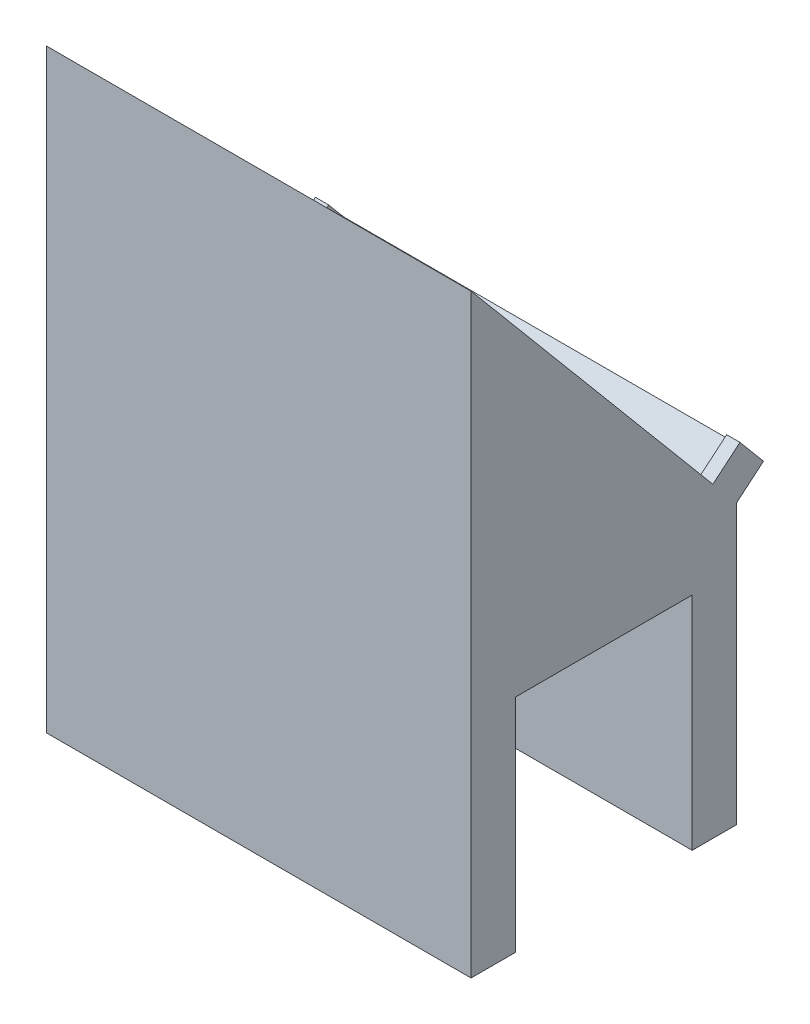
ISO-10303-21;
HEADER;
FILE_DESCRIPTION(('STEP AP214'),'2;1');
FILE_NAME('part.step','',(''),(''),'','','');
FILE_SCHEMA(('AUTOMOTIVE_DESIGN { 1 0 10303 214 1 1 1 1 }'));
ENDSEC;
DATA;
#1=APPLICATION_CONTEXT('core data for automotive mechanical design processes');
#2=APPLICATION_PROTOCOL_DEFINITION('international standard','automotive_design',2000,#1);
#3=PRODUCT_CONTEXT('',#1,'mechanical');
#4=PRODUCT('Part','Part','',(#3));
#5=PRODUCT_RELATED_PRODUCT_CATEGORY('part','',(#4));
#6=PRODUCT_DEFINITION_FORMATION('','',#4);
#7=PRODUCT_DEFINITION_CONTEXT('part definition',#1,'design');
#8=PRODUCT_DEFINITION('design','',#6,#7);
#9=PRODUCT_DEFINITION_SHAPE('','',#8);
#10=(LENGTH_UNIT() NAMED_UNIT(*) SI_UNIT(.MILLI.,.METRE.));
#11=(NAMED_UNIT(*) PLANE_ANGLE_UNIT() SI_UNIT($,.RADIAN.));
#12=(NAMED_UNIT(*) SI_UNIT($,.STERADIAN.) SOLID_ANGLE_UNIT());
#13=UNCERTAINTY_MEASURE_WITH_UNIT(LENGTH_MEASURE(1.E-05),#10,'distance_accuracy_value','');
#14=(GEOMETRIC_REPRESENTATION_CONTEXT(3) GLOBAL_UNCERTAINTY_ASSIGNED_CONTEXT((#13)) GLOBAL_UNIT_ASSIGNED_CONTEXT((#10,
#11,#12)) REPRESENTATION_CONTEXT('',''));
#15=CARTESIAN_POINT('',(0.,0.,0.));
#16=DIRECTION('',(0.,0.,1.));
#17=DIRECTION('',(1.,0.,0.));
#18=AXIS2_PLACEMENT_3D('',#15,#16,#17);
#19=CARTESIAN_POINT('',(96.,109.262066558535,0.));
#20=DIRECTION('',(0.,0.64278760968654,-0.766044443118977));
#21=DIRECTION('',(0.,0.766044443118977,0.64278760968654));
#22=AXIS2_PLACEMENT_3D('',#19,#20,#21);
#23=PLANE('',#22);
#24=DIRECTION('',(0.,-0.766044443118977,-0.64278760968654));
#25=VECTOR('',#24,1.);
#26=CARTESIAN_POINT('',(96.,109.262066558535,0.));
#27=LINE('',#26,#25);
#28=CARTESIAN_POINT('',(96.,109.262066558535,0.));
#29=VERTEX_POINT('',#28);
#30=CARTESIAN_POINT('',(96.,44.106186697576,-54.6722747603623));
#31=VERTEX_POINT('',#30);
#32=EDGE_CURVE('E247',#29,#31,#27,.T.);
#33=ORIENTED_EDGE('',*,*,#32,.T.);
#34=DIRECTION('',(-1.,0.,0.));
#35=VECTOR('',#34,1.);
#36=CARTESIAN_POINT('',(0.,44.106186697576,-54.6722747603623));
#37=LINE('',#36,#35);
#38=CARTESIAN_POINT('',(93.,44.106186697576,-54.6722747603623));
#39=VERTEX_POINT('',#38);
#40=EDGE_CURVE('E89',#31,#39,#37,.T.);
#41=ORIENTED_EDGE('',*,*,#40,.T.);
#42=DIRECTION('',(0.,-0.766044443118977,-0.64278760968654));
#43=VECTOR('',#42,1.);
#44=CARTESIAN_POINT('',(93.,45.1444539062616,-53.8010651284908));
#45=LINE('',#44,#43);
#46=CARTESIAN_POINT('',(93.,40.0549843322399,-58.0716371709404));
#47=VERTEX_POINT('',#46);
#48=EDGE_CURVE('E94',#39,#47,#45,.T.);
#49=ORIENTED_EDGE('',*,*,#48,.T.);
#50=DIRECTION('',(-1.,0.,0.));
#51=VECTOR('',#50,1.);
#52=CARTESIAN_POINT('',(0.,40.0549843322399,-58.0716371709404));
#53=LINE('',#52,#51);
#54=CARTESIAN_POINT('',(3.,40.0549843322399,-58.0716371709404));
#55=VERTEX_POINT('',#54);
#56=EDGE_CURVE('E239',#47,#55,#53,.T.);
#57=ORIENTED_EDGE('',*,*,#56,.T.);
#58=DIRECTION('',(0.,-0.766044443118977,-0.642787609686541));
#59=VECTOR('',#58,1.);
#60=CARTESIAN_POINT('',(3.,44.106186697576,-54.6722747603623));
#61=LINE('',#60,#59);
#62=CARTESIAN_POINT('',(3.,44.106186697576,-54.6722747603623));
#63=VERTEX_POINT('',#62);
#64=EDGE_CURVE('E230',#63,#55,#61,.T.);
#65=ORIENTED_EDGE('',*,*,#64,.F.);
#66=DIRECTION('',(1.,0.,0.));
#67=VECTOR('',#66,1.);
#68=CARTESIAN_POINT('',(0.,44.106186697576,-54.6722747603623));
#69=LINE('',#68,#67);
#70=CARTESIAN_POINT('',(0.,44.106186697576,-54.6722747603623));
#71=VERTEX_POINT('',#70);
#72=EDGE_CURVE('E226',#71,#63,#69,.T.);
#73=ORIENTED_EDGE('',*,*,#72,.F.);
#74=DIRECTION('',(0.,-0.766044443118977,-0.64278760968654));
#75=VECTOR('',#74,1.);
#76=CARTESIAN_POINT('',(0.,109.262066558535,0.));
#77=LINE('',#76,#75);
#78=CARTESIAN_POINT('',(0.,109.262066558535,0.));
#79=VERTEX_POINT('',#78);
#80=EDGE_CURVE('E274',#79,#71,#77,.T.);
#81=ORIENTED_EDGE('',*,*,#80,.F.);
#82=DIRECTION('',(-1.,0.,0.));
#83=VECTOR('',#82,1.);
#84=CARTESIAN_POINT('',(96.,109.262066558535,0.));
#85=LINE('',#84,#83);
#86=EDGE_CURVE('E75',#29,#79,#85,.T.);
#87=ORIENTED_EDGE('',*,*,#86,.F.);
#88=EDGE_LOOP('',(#33,#41,#49,#57,#65,#73,#81,#87));
#89=FACE_BOUND('',#88,.T.);
#90=ADVANCED_FACE('F71',(#89),#23,.T.);
#91=CARTESIAN_POINT('',(96.,-25.2428594307041,0.));
#92=DIRECTION('',(0.,0.,1.));
#93=DIRECTION('',(1.,0.,0.));
#94=AXIS2_PLACEMENT_3D('',#91,#92,#93);
#95=PLANE('',#94);
#96=DIRECTION('',(0.,1.,0.));
#97=VECTOR('',#96,1.);
#98=CARTESIAN_POINT('',(0.,-25.2428594307041,0.));
#99=LINE('',#98,#97);
#100=CARTESIAN_POINT('',(0.,-25.2428594307041,0.));
#101=VERTEX_POINT('',#100);
#102=EDGE_CURVE('E215',#101,#79,#99,.T.);
#103=ORIENTED_EDGE('',*,*,#102,.F.);
#104=DIRECTION('',(-1.,0.,0.));
#105=VECTOR('',#104,1.);
#106=CARTESIAN_POINT('',(96.,-25.2428594307041,0.));
#107=LINE('',#106,#105);
#108=CARTESIAN_POINT('',(96.,-25.2428594307041,0.));
#109=VERTEX_POINT('',#108);
#110=EDGE_CURVE('E12',#109,#101,#107,.T.);
#111=ORIENTED_EDGE('',*,*,#110,.F.);
#112=DIRECTION('',(0.,1.,0.));
#113=VECTOR('',#112,1.);
#114=CARTESIAN_POINT('',(96.,-25.2428594307041,0.));
#115=LINE('',#114,#113);
#116=EDGE_CURVE('E243',#109,#29,#115,.T.);
#117=ORIENTED_EDGE('',*,*,#116,.T.);
#118=ORIENTED_EDGE('',*,*,#86,.T.);
#119=EDGE_LOOP('',(#103,#111,#117,#118));
#120=FACE_BOUND('',#119,.T.);
#121=ADVANCED_FACE('F73',(#120),#95,.T.);
#122=CARTESIAN_POINT('',(96.,-25.2428594307041,-10.));
#123=DIRECTION('',(0.,-1.,0.));
#124=DIRECTION('',(0.,0.,-1.));
#125=AXIS2_PLACEMENT_3D('',#122,#123,#124);
#126=PLANE('',#125);
#127=DIRECTION('',(0.,0.,1.));
#128=VECTOR('',#127,1.);
#129=CARTESIAN_POINT('',(0.,-25.2428594307041,-10.));
#130=LINE('',#129,#128);
#131=CARTESIAN_POINT('',(0.,-25.2428594307041,-10.));
#132=VERTEX_POINT('',#131);
#133=EDGE_CURVE('E248',#132,#101,#130,.T.);
#134=ORIENTED_EDGE('',*,*,#133,.F.);
#135=DIRECTION('',(-1.,0.,0.));
#136=VECTOR('',#135,1.);
#137=CARTESIAN_POINT('',(96.,-25.2428594307041,-10.));
#138=LINE('',#137,#136);
#139=CARTESIAN_POINT('',(96.,-25.2428594307041,-10.));
#140=VERTEX_POINT('',#139);
#141=EDGE_CURVE('E81',#140,#132,#138,.T.);
#142=ORIENTED_EDGE('',*,*,#141,.F.);
#143=DIRECTION('',(0.,0.,1.));
#144=VECTOR('',#143,1.);
#145=CARTESIAN_POINT('',(96.,-25.2428594307041,-10.));
#146=LINE('',#145,#144);
#147=EDGE_CURVE('E268',#140,#109,#146,.T.);
#148=ORIENTED_EDGE('',*,*,#147,.T.);
#149=ORIENTED_EDGE('',*,*,#110,.T.);
#150=EDGE_LOOP('',(#134,#142,#148,#149));
#151=FACE_BOUND('',#150,.T.);
#152=ADVANCED_FACE('F323',(#151),#126,.T.);
#153=CARTESIAN_POINT('',(96.,-25.2428594307041,-10.));
#154=DIRECTION('',(0.,0.,1.));
#155=DIRECTION('',(1.,0.,0.));
#156=AXIS2_PLACEMENT_3D('',#153,#154,#155);
#157=PLANE('',#156);
#158=DIRECTION('',(0.,1.,0.));
#159=VECTOR('',#158,1.);
#160=CARTESIAN_POINT('',(0.,-25.2428594307041,-10.));
#161=LINE('',#160,#159);
#162=CARTESIAN_POINT('',(0.,24.7571405692959,-10.));
#163=VERTEX_POINT('',#162);
#164=EDGE_CURVE('E291',#132,#163,#161,.T.);
#165=ORIENTED_EDGE('',*,*,#164,.T.);
#166=DIRECTION('',(-1.,0.,0.));
#167=VECTOR('',#166,1.);
#168=CARTESIAN_POINT('',(96.,24.7571405692959,-10.));
#169=LINE('',#168,#167);
#170=CARTESIAN_POINT('',(96.,24.7571405692959,-10.));
#171=VERTEX_POINT('',#170);
#172=EDGE_CURVE('E299',#171,#163,#169,.T.);
#173=ORIENTED_EDGE('',*,*,#172,.F.);
#174=DIRECTION('',(0.,1.,0.));
#175=VECTOR('',#174,1.);
#176=CARTESIAN_POINT('',(96.,-25.2428594307041,-10.));
#177=LINE('',#176,#175);
#178=EDGE_CURVE('E265',#140,#171,#177,.T.);
#179=ORIENTED_EDGE('',*,*,#178,.F.);
#180=ORIENTED_EDGE('',*,*,#141,.T.);
#181=EDGE_LOOP('',(#165,#173,#179,#180));
#182=FACE_BOUND('',#181,.T.);
#183=ADVANCED_FACE('F398',(#182),#157,.F.);
#184=CARTESIAN_POINT('',(96.,24.7571405692959,-10.));
#185=DIRECTION('',(0.,1.,0.));
#186=DIRECTION('',(0.,0.,1.));
#187=AXIS2_PLACEMENT_3D('',#184,#185,#186);
#188=PLANE('',#187);
#189=DIRECTION('',(0.,0.,-1.));
#190=VECTOR('',#189,1.);
#191=CARTESIAN_POINT('',(0.,24.7571405692959,-10.));
#192=LINE('',#191,#190);
#193=CARTESIAN_POINT('',(0.,24.7571405692959,-50.));
#194=VERTEX_POINT('',#193);
#195=EDGE_CURVE('E288',#163,#194,#192,.T.);
#196=ORIENTED_EDGE('',*,*,#195,.T.);
#197=DIRECTION('',(-1.,0.,0.));
#198=VECTOR('',#197,1.);
#199=CARTESIAN_POINT('',(96.,24.7571405692959,-50.));
#200=LINE('',#199,#198);
#201=CARTESIAN_POINT('',(96.,24.7571405692959,-50.));
#202=VERTEX_POINT('',#201);
#203=EDGE_CURVE('E303',#202,#194,#200,.T.);
#204=ORIENTED_EDGE('',*,*,#203,.F.);
#205=DIRECTION('',(0.,0.,-1.));
#206=VECTOR('',#205,1.);
#207=CARTESIAN_POINT('',(96.,24.7571405692959,-10.));
#208=LINE('',#207,#206);
#209=EDGE_CURVE('E262',#171,#202,#208,.T.);
#210=ORIENTED_EDGE('',*,*,#209,.F.);
#211=ORIENTED_EDGE('',*,*,#172,.T.);
#212=EDGE_LOOP('',(#196,#204,#210,#211));
#213=FACE_BOUND('',#212,.T.);
#214=ADVANCED_FACE('F394',(#213),#188,.F.);
#215=CARTESIAN_POINT('',(96.,24.7571405692959,-50.));
#216=DIRECTION('',(0.,0.,-1.));
#217=DIRECTION('',(0.,1.,0.));
#218=AXIS2_PLACEMENT_3D('',#215,#216,#217);
#219=PLANE('',#218);
#220=DIRECTION('',(0.,-1.,0.));
#221=VECTOR('',#220,1.);
#222=CARTESIAN_POINT('',(0.,24.7571405692959,-50.));
#223=LINE('',#222,#221);
#224=CARTESIAN_POINT('',(0.,-25.2428594307041,-50.));
#225=VERTEX_POINT('',#224);
#226=EDGE_CURVE('E284',#194,#225,#223,.T.);
#227=ORIENTED_EDGE('',*,*,#226,.T.);
#228=DIRECTION('',(-1.,0.,0.));
#229=VECTOR('',#228,1.);
#230=CARTESIAN_POINT('',(96.,-25.2428594307041,-50.));
#231=LINE('',#230,#229);
#232=CARTESIAN_POINT('',(96.,-25.2428594307041,-50.));
#233=VERTEX_POINT('',#232);
#234=EDGE_CURVE('E307',#233,#225,#231,.T.);
#235=ORIENTED_EDGE('',*,*,#234,.F.);
#236=DIRECTION('',(0.,-1.,0.));
#237=VECTOR('',#236,1.);
#238=CARTESIAN_POINT('',(96.,24.7571405692959,-50.));
#239=LINE('',#238,#237);
#240=EDGE_CURVE('E259',#202,#233,#239,.T.);
#241=ORIENTED_EDGE('',*,*,#240,.F.);
#242=ORIENTED_EDGE('',*,*,#203,.T.);
#243=EDGE_LOOP('',(#227,#235,#241,#242));
#244=FACE_BOUND('',#243,.T.);
#245=ADVANCED_FACE('F390',(#244),#219,.F.);
#246=CARTESIAN_POINT('',(96.,-25.2428594307041,-60.));
#247=DIRECTION('',(0.,-1.,0.));
#248=DIRECTION('',(0.,0.,-1.));
#249=AXIS2_PLACEMENT_3D('',#246,#247,#248);
#250=PLANE('',#249);
#251=DIRECTION('',(0.,0.,1.));
#252=VECTOR('',#251,1.);
#253=CARTESIAN_POINT('',(0.,-25.2428594307041,-60.));
#254=LINE('',#253,#252);
#255=CARTESIAN_POINT('',(0.,-25.2428594307041,-60.));
#256=VERTEX_POINT('',#255);
#257=EDGE_CURVE('E280',#256,#225,#254,.T.);
#258=ORIENTED_EDGE('',*,*,#257,.F.);
#259=DIRECTION('',(-1.,0.,0.));
#260=VECTOR('',#259,1.);
#261=CARTESIAN_POINT('',(96.,-25.2428594307041,-60.));
#262=LINE('',#261,#260);
#263=CARTESIAN_POINT('',(96.,-25.2428594307041,-60.));
#264=VERTEX_POINT('',#263);
#265=EDGE_CURVE('E310',#264,#256,#262,.T.);
#266=ORIENTED_EDGE('',*,*,#265,.F.);
#267=DIRECTION('',(0.,0.,1.));
#268=VECTOR('',#267,1.);
#269=CARTESIAN_POINT('',(96.,-25.2428594307041,-60.));
#270=LINE('',#269,#268);
#271=EDGE_CURVE('E255',#264,#233,#270,.T.);
#272=ORIENTED_EDGE('',*,*,#271,.T.);
#273=ORIENTED_EDGE('',*,*,#234,.T.);
#274=EDGE_LOOP('',(#258,#266,#272,#273));
#275=FACE_BOUND('',#274,.T.);
#276=ADVANCED_FACE('F386',(#275),#250,.T.);
#277=CARTESIAN_POINT('',(96.,37.7568510028829,-60.));
#278=DIRECTION('',(0.,0.,-1.));
#279=DIRECTION('',(-1.,0.,0.));
#280=AXIS2_PLACEMENT_3D('',#277,#278,#279);
#281=PLANE('',#280);
#282=DIRECTION('',(0.,-1.,0.));
#283=VECTOR('',#282,1.);
#284=CARTESIAN_POINT('',(0.,37.7568510028829,-60.));
#285=LINE('',#284,#283);
#286=CARTESIAN_POINT('',(0.,37.7568510028829,-60.));
#287=VERTEX_POINT('',#286);
#288=EDGE_CURVE('E277',#287,#256,#285,.T.);
#289=ORIENTED_EDGE('',*,*,#288,.F.);
#290=DIRECTION('',(-1.,0.,0.));
#291=VECTOR('',#290,1.);
#292=CARTESIAN_POINT('',(96.,37.7568510028829,-60.));
#293=LINE('',#292,#291);
#294=CARTESIAN_POINT('',(96.,37.7568510028829,-60.));
#295=VERTEX_POINT('',#294);
#296=EDGE_CURVE('E207',#295,#287,#293,.T.);
#297=ORIENTED_EDGE('',*,*,#296,.F.);
#298=DIRECTION('',(0.,-1.,0.));
#299=VECTOR('',#298,1.);
#300=CARTESIAN_POINT('',(96.,37.7568510028829,-60.));
#301=LINE('',#300,#299);
#302=EDGE_CURVE('E251',#295,#264,#301,.T.);
#303=ORIENTED_EDGE('',*,*,#302,.T.);
#304=ORIENTED_EDGE('',*,*,#265,.T.);
#305=EDGE_LOOP('',(#289,#297,#303,#304));
#306=FACE_BOUND('',#305,.T.);
#307=ADVANCED_FACE('F383',(#306),#281,.T.);
#308=CARTESIAN_POINT('',(96.,0.,0.));
#309=DIRECTION('',(1.,0.,0.));
#310=DIRECTION('',(0.,0.,-1.));
#311=AXIS2_PLACEMENT_3D('',#308,#309,#310);
#312=PLANE('',#311);
#313=ORIENTED_EDGE('',*,*,#116,.F.);
#314=ORIENTED_EDGE('',*,*,#147,.F.);
#315=ORIENTED_EDGE('',*,*,#178,.T.);
#316=ORIENTED_EDGE('',*,*,#209,.T.);
#317=ORIENTED_EDGE('',*,*,#240,.T.);
#318=ORIENTED_EDGE('',*,*,#271,.F.);
#319=ORIENTED_EDGE('',*,*,#302,.F.);
#320=DIRECTION('',(0.,-0.64278760968654,0.766044443118977));
#321=VECTOR('',#320,1.);
#322=CARTESIAN_POINT('',(96.,42.8991518803753,-66.1283555449518));
#323=LINE('',#322,#321);
#324=CARTESIAN_POINT('',(96.,42.8991518803753,-66.1283555449518));
#325=VERTEX_POINT('',#324);
#326=EDGE_CURVE('E333',#325,#295,#323,.T.);
#327=ORIENTED_EDGE('',*,*,#326,.F.);
#328=DIRECTION('',(0.,-0.766044443118977,-0.64278760968654));
#329=VECTOR('',#328,1.);
#330=CARTESIAN_POINT('',(96.,50.2867547837539,-59.9294206734426));
#331=LINE('',#330,#329);
#332=CARTESIAN_POINT('',(96.,49.2484875750684,-60.8006303053141));
#333=VERTEX_POINT('',#332);
#334=EDGE_CURVE('E185',#333,#325,#331,.T.);
#335=ORIENTED_EDGE('',*,*,#334,.F.);
#336=DIRECTION('',(0.,-0.64278760968654,0.766044443118977));
#337=VECTOR('',#336,1.);
#338=CARTESIAN_POINT('',(96.,49.2484875750684,-60.8006303053141));
#339=LINE('',#338,#337);
#340=EDGE_CURVE('E329',#333,#31,#339,.T.);
#341=ORIENTED_EDGE('',*,*,#340,.T.);
#342=ORIENTED_EDGE('',*,*,#32,.F.);
#343=EDGE_LOOP('',(#313,#314,#315,#316,#317,#318,#319,#327,#335,#341,#342));
#344=FACE_BOUND('',#343,.T.);
#345=ADVANCED_FACE('F327',(#344),#312,.T.);
#346=CARTESIAN_POINT('',(0.,0.,0.));
#347=DIRECTION('',(1.,0.,0.));
#348=DIRECTION('',(0.,0.,-1.));
#349=AXIS2_PLACEMENT_3D('',#346,#347,#348);
#350=PLANE('',#349);
#351=ORIENTED_EDGE('',*,*,#102,.T.);
#352=ORIENTED_EDGE('',*,*,#80,.T.);
#353=DIRECTION('',(0.,-0.64278760968654,0.766044443118977));
#354=VECTOR('',#353,1.);
#355=CARTESIAN_POINT('',(0.,49.2484875750683,-60.8006303053141));
#356=LINE('',#355,#354);
#357=CARTESIAN_POINT('',(0.,49.2484875750683,-60.8006303053141));
#358=VERTEX_POINT('',#357);
#359=EDGE_CURVE('E200',#358,#71,#356,.T.);
#360=ORIENTED_EDGE('',*,*,#359,.F.);
#361=DIRECTION('',(0.,0.766044443118977,0.64278760968654));
#362=VECTOR('',#361,1.);
#363=CARTESIAN_POINT('',(0.,50.2867547837539,-59.9294206734426));
#364=LINE('',#363,#362);
#365=CARTESIAN_POINT('',(0.,42.8991518803753,-66.1283555449518));
#366=VERTEX_POINT('',#365);
#367=EDGE_CURVE('E181',#366,#358,#364,.T.);
#368=ORIENTED_EDGE('',*,*,#367,.F.);
#369=DIRECTION('',(0.,-0.64278760968654,0.766044443118977));
#370=VECTOR('',#369,1.);
#371=CARTESIAN_POINT('',(0.,42.8991518803753,-66.1283555449518));
#372=LINE('',#371,#370);
#373=EDGE_CURVE('E197',#366,#287,#372,.T.);
#374=ORIENTED_EDGE('',*,*,#373,.T.);
#375=ORIENTED_EDGE('',*,*,#288,.T.);
#376=ORIENTED_EDGE('',*,*,#257,.T.);
#377=ORIENTED_EDGE('',*,*,#226,.F.);
#378=ORIENTED_EDGE('',*,*,#195,.F.);
#379=ORIENTED_EDGE('',*,*,#164,.F.);
#380=ORIENTED_EDGE('',*,*,#133,.T.);
#381=EDGE_LOOP('',(#351,#352,#360,#368,#374,#375,#376,#377,#378,#379,#380));
#382=FACE_BOUND('',#381,.T.);
#383=ADVANCED_FACE('F195',(#382),#350,.F.);
#384=CARTESIAN_POINT('',(0.,42.8991518803753,-66.1283555449518));
#385=DIRECTION('',(0.,0.766044443118977,0.64278760968654));
#386=DIRECTION('',(0.,-0.64278760968654,0.766044443118977));
#387=AXIS2_PLACEMENT_3D('',#384,#385,#386);
#388=PLANE('',#387);
#389=ORIENTED_EDGE('',*,*,#373,.F.);
#390=DIRECTION('',(-1.,0.,0.));
#391=VECTOR('',#390,1.);
#392=CARTESIAN_POINT('',(0.,42.8991518803753,-66.1283555449518));
#393=LINE('',#392,#391);
#394=EDGE_CURVE('E178',#325,#366,#393,.T.);
#395=ORIENTED_EDGE('',*,*,#394,.F.);
#396=ORIENTED_EDGE('',*,*,#326,.T.);
#397=ORIENTED_EDGE('',*,*,#296,.T.);
#398=EDGE_LOOP('',(#389,#395,#396,#397));
#399=FACE_BOUND('',#398,.T.);
#400=ADVANCED_FACE('F206',(#399),#388,.F.);
#401=CARTESIAN_POINT('',(0.,50.2867547837539,-59.9294206734426));
#402=DIRECTION('',(0.,0.64278760968654,-0.766044443118977));
#403=DIRECTION('',(0.,0.766044443118977,0.64278760968654));
#404=AXIS2_PLACEMENT_3D('',#401,#402,#403);
#405=PLANE('',#404);
#406=ORIENTED_EDGE('',*,*,#367,.T.);
#407=DIRECTION('',(1.,0.,0.));
#408=VECTOR('',#407,1.);
#409=CARTESIAN_POINT('',(0.,49.2484875750683,-60.8006303053141));
#410=LINE('',#409,#408);
#411=CARTESIAN_POINT('',(3.,49.2484875750683,-60.8006303053141));
#412=VERTEX_POINT('',#411);
#413=EDGE_CURVE('E225',#358,#412,#410,.T.);
#414=ORIENTED_EDGE('',*,*,#413,.T.);
#415=DIRECTION('',(0.,-0.766044443118977,-0.642787609686541));
#416=VECTOR('',#415,1.);
#417=CARTESIAN_POINT('',(3.,49.2484875750683,-60.8006303053141));
#418=LINE('',#417,#416);
#419=CARTESIAN_POINT('',(3.,45.1972852097322,-64.1999927158922));
#420=VERTEX_POINT('',#419);
#421=EDGE_CURVE('E221',#412,#420,#418,.T.);
#422=ORIENTED_EDGE('',*,*,#421,.T.);
#423=DIRECTION('',(-1.,0.,0.));
#424=VECTOR('',#423,1.);
#425=CARTESIAN_POINT('',(0.,45.1972852097322,-64.1999927158922));
#426=LINE('',#425,#424);
#427=CARTESIAN_POINT('',(93.,45.1972852097322,-64.1999927158922));
#428=VERTEX_POINT('',#427);
#429=EDGE_CURVE('E203',#428,#420,#426,.T.);
#430=ORIENTED_EDGE('',*,*,#429,.F.);
#431=DIRECTION('',(0.,-0.766044443118977,-0.64278760968654));
#432=VECTOR('',#431,1.);
#433=CARTESIAN_POINT('',(93.,50.2867547837539,-59.9294206734426));
#434=LINE('',#433,#432);
#435=CARTESIAN_POINT('',(93.,49.2484875750684,-60.8006303053141));
#436=VERTEX_POINT('',#435);
#437=EDGE_CURVE('E349',#436,#428,#434,.T.);
#438=ORIENTED_EDGE('',*,*,#437,.F.);
#439=DIRECTION('',(-1.,0.,0.));
#440=VECTOR('',#439,1.);
#441=CARTESIAN_POINT('',(0.,49.2484875750683,-60.8006303053141));
#442=LINE('',#441,#440);
#443=EDGE_CURVE('E346',#333,#436,#442,.T.);
#444=ORIENTED_EDGE('',*,*,#443,.F.);
#445=ORIENTED_EDGE('',*,*,#334,.T.);
#446=ORIENTED_EDGE('',*,*,#394,.T.);
#447=EDGE_LOOP('',(#406,#414,#422,#430,#438,#444,#445,#446));
#448=FACE_BOUND('',#447,.T.);
#449=ADVANCED_FACE('F180',(#448),#405,.T.);
#450=CARTESIAN_POINT('',(0.,45.1972852097322,-64.1999927158922));
#451=DIRECTION('',(0.,0.766044443118977,0.64278760968654));
#452=DIRECTION('',(0.,-0.64278760968654,0.766044443118977));
#453=AXIS2_PLACEMENT_3D('',#450,#451,#452);
#454=PLANE('',#453);
#455=ORIENTED_EDGE('',*,*,#429,.T.);
#456=DIRECTION('',(0.,-0.64278760968654,0.766044443118977));
#457=VECTOR('',#456,1.);
#458=CARTESIAN_POINT('',(3.,45.1972852097322,-64.1999927158922));
#459=LINE('',#458,#457);
#460=EDGE_CURVE('E209',#420,#55,#459,.T.);
#461=ORIENTED_EDGE('',*,*,#460,.T.);
#462=ORIENTED_EDGE('',*,*,#56,.F.);
#463=DIRECTION('',(0.,-0.64278760968654,0.766044443118977));
#464=VECTOR('',#463,1.);
#465=CARTESIAN_POINT('',(93.,45.1972852097322,-64.1999927158922));
#466=LINE('',#465,#464);
#467=EDGE_CURVE('E210',#428,#47,#466,.T.);
#468=ORIENTED_EDGE('',*,*,#467,.F.);
#469=EDGE_LOOP('',(#455,#461,#462,#468));
#470=FACE_BOUND('',#469,.T.);
#471=ADVANCED_FACE('F360',(#470),#454,.T.);
#472=CARTESIAN_POINT('',(93.,50.2867547837539,-59.9294206734426));
#473=DIRECTION('',(-1.,0.,0.));
#474=DIRECTION('',(0.,0.,1.));
#475=AXIS2_PLACEMENT_3D('',#472,#473,#474);
#476=PLANE('',#475);
#477=ORIENTED_EDGE('',*,*,#48,.F.);
#478=DIRECTION('',(0.,-0.64278760968654,0.766044443118977));
#479=VECTOR('',#478,1.);
#480=CARTESIAN_POINT('',(93.,49.2484875750684,-60.8006303053141));
#481=LINE('',#480,#479);
#482=EDGE_CURVE('E217',#436,#39,#481,.T.);
#483=ORIENTED_EDGE('',*,*,#482,.F.);
#484=ORIENTED_EDGE('',*,*,#437,.T.);
#485=ORIENTED_EDGE('',*,*,#467,.T.);
#486=EDGE_LOOP('',(#477,#483,#484,#485));
#487=FACE_BOUND('',#486,.T.);
#488=ADVANCED_FACE('F369',(#487),#476,.T.);
#489=CARTESIAN_POINT('',(0.,49.2484875750683,-60.8006303053141));
#490=DIRECTION('',(0.,0.766044443118977,0.64278760968654));
#491=DIRECTION('',(0.,-0.64278760968654,0.766044443118977));
#492=AXIS2_PLACEMENT_3D('',#489,#490,#491);
#493=PLANE('',#492);
#494=ORIENTED_EDGE('',*,*,#40,.F.);
#495=ORIENTED_EDGE('',*,*,#340,.F.);
#496=ORIENTED_EDGE('',*,*,#443,.T.);
#497=ORIENTED_EDGE('',*,*,#482,.T.);
#498=EDGE_LOOP('',(#494,#495,#496,#497));
#499=FACE_BOUND('',#498,.T.);
#500=ADVANCED_FACE('F335',(#499),#493,.T.);
#501=CARTESIAN_POINT('',(0.,49.2484875750683,-60.8006303053141));
#502=DIRECTION('',(0.,-0.766044443118977,-0.64278760968654));
#503=DIRECTION('',(0.,0.64278760968654,-0.766044443118977));
#504=AXIS2_PLACEMENT_3D('',#501,#502,#503);
#505=PLANE('',#504);
#506=ORIENTED_EDGE('',*,*,#72,.T.);
#507=DIRECTION('',(0.,-0.64278760968654,0.766044443118977));
#508=VECTOR('',#507,1.);
#509=CARTESIAN_POINT('',(3.,49.2484875750683,-60.8006303053141));
#510=LINE('',#509,#508);
#511=EDGE_CURVE('E229',#412,#63,#510,.T.);
#512=ORIENTED_EDGE('',*,*,#511,.F.);
#513=ORIENTED_EDGE('',*,*,#413,.F.);
#514=ORIENTED_EDGE('',*,*,#359,.T.);
#515=EDGE_LOOP('',(#506,#512,#513,#514));
#516=FACE_BOUND('',#515,.T.);
#517=ADVANCED_FACE('F366',(#516),#505,.F.);
#518=CARTESIAN_POINT('',(3.,49.2484875750683,-60.8006303053141));
#519=DIRECTION('',(-1.,0.,0.));
#520=DIRECTION('',(0.,-1.,0.));
#521=AXIS2_PLACEMENT_3D('',#518,#519,#520);
#522=PLANE('',#521);
#523=ORIENTED_EDGE('',*,*,#460,.F.);
#524=ORIENTED_EDGE('',*,*,#421,.F.);
#525=ORIENTED_EDGE('',*,*,#511,.T.);
#526=ORIENTED_EDGE('',*,*,#64,.T.);
#527=EDGE_LOOP('',(#523,#524,#525,#526));
#528=FACE_BOUND('',#527,.T.);
#529=ADVANCED_FACE('F363',(#528),#522,.F.);
#530=CLOSED_SHELL('',(#90,#121,#152,#183,#214,#245,#276,#307,#345,#383,#400,#449,#471,#488,#500,
#517,#529));
#531=MANIFOLD_SOLID_BREP('B2',#530);
#532=ADVANCED_BREP_SHAPE_REPRESENTATION('',(#18,#531),#14);
#533=SHAPE_DEFINITION_REPRESENTATION(#9,#532);
ENDSEC;
END-ISO-10303-21;
